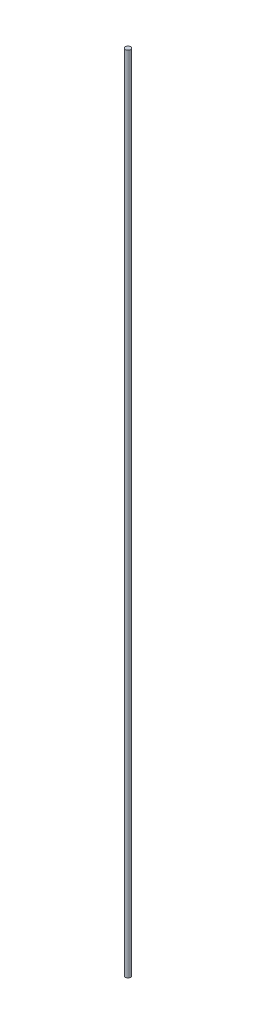
ISO-10303-21;
HEADER;
FILE_DESCRIPTION(('STEP AP214'),'2;1');
FILE_NAME('part.step','',(''),(''),'','','');
FILE_SCHEMA(('AUTOMOTIVE_DESIGN { 1 0 10303 214 1 1 1 1 }'));
ENDSEC;
DATA;
#1=APPLICATION_CONTEXT('core data for automotive mechanical design processes');
#2=APPLICATION_PROTOCOL_DEFINITION('international standard','automotive_design',2000,#1);
#3=PRODUCT_CONTEXT('',#1,'mechanical');
#4=PRODUCT('Part','Part','',(#3));
#5=PRODUCT_RELATED_PRODUCT_CATEGORY('part','',(#4));
#6=PRODUCT_DEFINITION_FORMATION('','',#4);
#7=PRODUCT_DEFINITION_CONTEXT('part definition',#1,'design');
#8=PRODUCT_DEFINITION('design','',#6,#7);
#9=PRODUCT_DEFINITION_SHAPE('','',#8);
#10=(LENGTH_UNIT() NAMED_UNIT(*) SI_UNIT(.MILLI.,.METRE.));
#11=(NAMED_UNIT(*) PLANE_ANGLE_UNIT() SI_UNIT($,.RADIAN.));
#12=(NAMED_UNIT(*) SI_UNIT($,.STERADIAN.) SOLID_ANGLE_UNIT());
#13=UNCERTAINTY_MEASURE_WITH_UNIT(LENGTH_MEASURE(1.E-05),#10,'distance_accuracy_value','');
#14=(GEOMETRIC_REPRESENTATION_CONTEXT(3) GLOBAL_UNCERTAINTY_ASSIGNED_CONTEXT((#13)) GLOBAL_UNIT_ASSIGNED_CONTEXT((#10,
#11,#12)) REPRESENTATION_CONTEXT('',''));
#15=CARTESIAN_POINT('',(0.,0.,0.));
#16=DIRECTION('',(0.,0.,1.));
#17=DIRECTION('',(1.,0.,0.));
#18=AXIS2_PLACEMENT_3D('',#15,#16,#17);
#19=CARTESIAN_POINT('',(0.,622.,0.));
#20=DIRECTION('',(0.,-1.,0.));
#21=DIRECTION('',(0.,0.,-1.));
#22=AXIS2_PLACEMENT_3D('',#19,#20,#21);
#23=CYLINDRICAL_SURFACE('',#22,2.);
#24=CARTESIAN_POINT('',(0.,622.,0.));
#25=DIRECTION('',(0.,1.,0.));
#26=DIRECTION('',(0.,0.,1.));
#27=AXIS2_PLACEMENT_3D('',#24,#25,#26);
#28=CIRCLE('',#27,2.);
#29=CARTESIAN_POINT('',(0.,622.,2.));
#30=VERTEX_POINT('',#29);
#31=EDGE_CURVE('E10',#30,#30,#28,.T.);
#32=ORIENTED_EDGE('',*,*,#31,.F.);
#33=EDGE_LOOP('',(#32));
#34=FACE_BOUND('',#33,.T.);
#35=CARTESIAN_POINT('',(0.,0.,0.));
#36=DIRECTION('',(0.,1.,0.));
#37=DIRECTION('',(0.,0.,1.));
#38=AXIS2_PLACEMENT_3D('',#35,#36,#37);
#39=CIRCLE('',#38,2.);
#40=CARTESIAN_POINT('',(0.,0.,2.));
#41=VERTEX_POINT('',#40);
#42=EDGE_CURVE('E46',#41,#41,#39,.T.);
#43=ORIENTED_EDGE('',*,*,#42,.T.);
#44=EDGE_LOOP('',(#43));
#45=FACE_BOUND('',#44,.T.);
#46=ADVANCED_FACE('F43',(#34,#45),#23,.T.);
#47=CARTESIAN_POINT('',(0.,622.,0.));
#48=DIRECTION('',(0.,1.,0.));
#49=DIRECTION('',(0.,0.,1.));
#50=AXIS2_PLACEMENT_3D('',#47,#48,#49);
#51=PLANE('',#50);
#52=ORIENTED_EDGE('',*,*,#31,.T.);
#53=EDGE_LOOP('',(#52));
#54=FACE_BOUND('',#53,.T.);
#55=ADVANCED_FACE('F60',(#54),#51,.T.);
#56=CARTESIAN_POINT('',(0.,0.,0.));
#57=DIRECTION('',(0.,1.,0.));
#58=DIRECTION('',(0.,0.,1.));
#59=AXIS2_PLACEMENT_3D('',#56,#57,#58);
#60=PLANE('',#59);
#61=ORIENTED_EDGE('',*,*,#42,.F.);
#62=EDGE_LOOP('',(#61));
#63=FACE_BOUND('',#62,.T.);
#64=ADVANCED_FACE('F58',(#63),#60,.F.);
#65=CLOSED_SHELL('',(#46,#55,#64));
#66=MANIFOLD_SOLID_BREP('B2',#65);
#67=ADVANCED_BREP_SHAPE_REPRESENTATION('',(#18,#66),#14);
#68=SHAPE_DEFINITION_REPRESENTATION(#9,#67);
ENDSEC;
END-ISO-10303-21;
